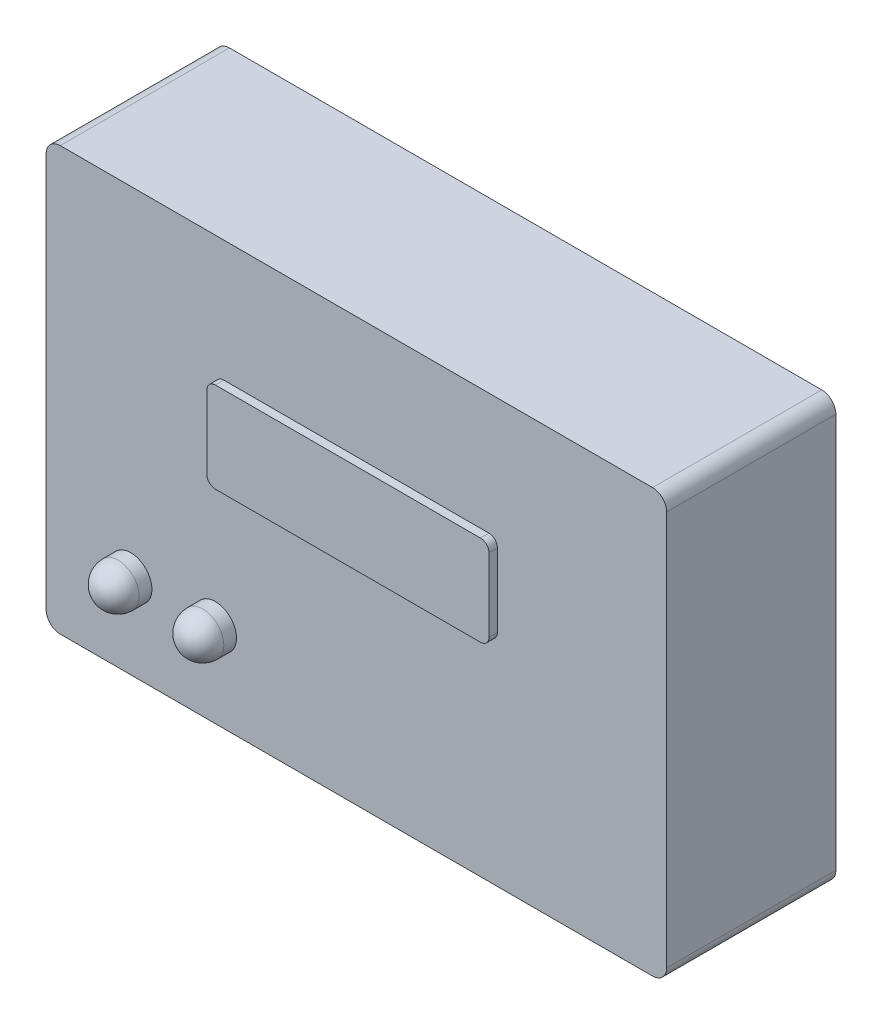
ISO-10303-21;
HEADER;
FILE_DESCRIPTION(('STEP AP214'),'2;1');
FILE_NAME('part.step','',(''),(''),'','','');
FILE_SCHEMA(('AUTOMOTIVE_DESIGN { 1 0 10303 214 1 1 1 1 }'));
ENDSEC;
DATA;
#1=APPLICATION_CONTEXT('core data for automotive mechanical design processes');
#2=APPLICATION_PROTOCOL_DEFINITION('international standard','automotive_design',2000,#1);
#3=PRODUCT_CONTEXT('',#1,'mechanical');
#4=PRODUCT('Part','Part','',(#3));
#5=PRODUCT_RELATED_PRODUCT_CATEGORY('part','',(#4));
#6=PRODUCT_DEFINITION_FORMATION('','',#4);
#7=PRODUCT_DEFINITION_CONTEXT('part definition',#1,'design');
#8=PRODUCT_DEFINITION('design','',#6,#7);
#9=PRODUCT_DEFINITION_SHAPE('','',#8);
#10=(LENGTH_UNIT() NAMED_UNIT(*) SI_UNIT(.MILLI.,.METRE.));
#11=(NAMED_UNIT(*) PLANE_ANGLE_UNIT() SI_UNIT($,.RADIAN.));
#12=(NAMED_UNIT(*) SI_UNIT($,.STERADIAN.) SOLID_ANGLE_UNIT());
#13=UNCERTAINTY_MEASURE_WITH_UNIT(LENGTH_MEASURE(1.E-05),#10,'distance_accuracy_value','');
#14=(GEOMETRIC_REPRESENTATION_CONTEXT(3) GLOBAL_UNCERTAINTY_ASSIGNED_CONTEXT((#13)) GLOBAL_UNIT_ASSIGNED_CONTEXT((#10,
#11,#12)) REPRESENTATION_CONTEXT('',''));
#15=CARTESIAN_POINT('',(0.,0.,0.));
#16=DIRECTION('',(0.,0.,1.));
#17=DIRECTION('',(1.,0.,0.));
#18=AXIS2_PLACEMENT_3D('',#15,#16,#17);
#19=CARTESIAN_POINT('',(-50.,-45.,42.));
#20=DIRECTION('',(0.,0.,-1.));
#21=DIRECTION('',(-1.,0.,0.));
#22=AXIS2_PLACEMENT_3D('',#19,#20,#21);
#23=CYLINDRICAL_SURFACE('',#22,7.5);
#24=CARTESIAN_POINT('',(-50.,-45.,34.5));
#25=DIRECTION('',(0.,0.,-1.));
#26=DIRECTION('',(-1.,0.,0.));
#27=AXIS2_PLACEMENT_3D('',#24,#25,#26);
#28=CIRCLE('',#27,7.5);
#29=CARTESIAN_POINT('',(-57.5,-45.,34.5));
#30=VERTEX_POINT('',#29);
#31=EDGE_CURVE('E11',#30,#30,#28,.T.);
#32=ORIENTED_EDGE('',*,*,#31,.T.);
#33=EDGE_LOOP('',(#32));
#34=FACE_BOUND('',#33,.T.);
#35=CARTESIAN_POINT('',(-50.,-45.,30.));
#36=DIRECTION('',(0.,0.,1.));
#37=DIRECTION('',(1.,0.,0.));
#38=AXIS2_PLACEMENT_3D('',#35,#36,#37);
#39=CIRCLE('',#38,7.5);
#40=CARTESIAN_POINT('',(-42.5,-45.,30.));
#41=VERTEX_POINT('',#40);
#42=EDGE_CURVE('E61',#41,#41,#39,.T.);
#43=ORIENTED_EDGE('',*,*,#42,.T.);
#44=EDGE_LOOP('',(#43));
#45=FACE_BOUND('',#44,.T.);
#46=ADVANCED_FACE('F54',(#34,#45),#23,.T.);
#47=CARTESIAN_POINT('',(-50.,-45.,30.));
#48=DIRECTION('',(0.,0.,1.));
#49=DIRECTION('',(1.,0.,0.));
#50=AXIS2_PLACEMENT_3D('',#47,#48,#49);
#51=PLANE('',#50);
#52=ORIENTED_EDGE('',*,*,#42,.F.);
#53=EDGE_LOOP('',(#52));
#54=FACE_BOUND('',#53,.T.);
#55=ADVANCED_FACE('F68',(#54),#51,.F.);
#56=CARTESIAN_POINT('',(-50.,-45.,34.5));
#57=DIRECTION('',(0.,0.,1.));
#58=DIRECTION('',(1.,0.,0.));
#59=AXIS2_PLACEMENT_3D('',#56,#57,#58);
#60=SPHERICAL_SURFACE('',#59,7.5);
#61=ORIENTED_EDGE('',*,*,#31,.F.);
#62=EDGE_LOOP('',(#61));
#63=FACE_BOUND('',#62,.T.);
#64=ADVANCED_FACE('F56',(#63),#60,.T.);
#65=CLOSED_SHELL('',(#46,#55,#64));
#66=MANIFOLD_SOLID_BREP('B2',#65);
#67=CARTESIAN_POINT('',(-80.,-45.,42.));
#68=DIRECTION('',(0.,0.,-1.));
#69=DIRECTION('',(-1.,0.,0.));
#70=AXIS2_PLACEMENT_3D('',#67,#68,#69);
#71=CYLINDRICAL_SURFACE('',#70,7.50000000000001);
#72=CARTESIAN_POINT('',(-80.,-45.,34.5));
#73=DIRECTION('',(0.,0.,-1.));
#74=DIRECTION('',(-1.,0.,0.));
#75=AXIS2_PLACEMENT_3D('',#72,#73,#74);
#76=CIRCLE('',#75,7.50000000000001);
#77=CARTESIAN_POINT('',(-87.5,-45.,34.5));
#78=VERTEX_POINT('',#77);
#79=EDGE_CURVE('E53',#78,#78,#76,.T.);
#80=ORIENTED_EDGE('',*,*,#79,.T.);
#81=EDGE_LOOP('',(#80));
#82=FACE_BOUND('',#81,.T.);
#83=CARTESIAN_POINT('',(-80.,-45.,30.));
#84=DIRECTION('',(0.,0.,1.));
#85=DIRECTION('',(1.,0.,0.));
#86=AXIS2_PLACEMENT_3D('',#83,#84,#85);
#87=CIRCLE('',#86,7.50000000000001);
#88=CARTESIAN_POINT('',(-72.5,-45.,30.));
#89=VERTEX_POINT('',#88);
#90=EDGE_CURVE('E112',#89,#89,#87,.T.);
#91=ORIENTED_EDGE('',*,*,#90,.T.);
#92=EDGE_LOOP('',(#91));
#93=FACE_BOUND('',#92,.T.);
#94=ADVANCED_FACE('F105',(#82,#93),#71,.T.);
#95=CARTESIAN_POINT('',(-80.,-45.,30.));
#96=DIRECTION('',(0.,0.,1.));
#97=DIRECTION('',(1.,0.,0.));
#98=AXIS2_PLACEMENT_3D('',#95,#96,#97);
#99=PLANE('',#98);
#100=ORIENTED_EDGE('',*,*,#90,.F.);
#101=EDGE_LOOP('',(#100));
#102=FACE_BOUND('',#101,.T.);
#103=ADVANCED_FACE('F119',(#102),#99,.F.);
#104=CARTESIAN_POINT('',(-80.,-45.,34.5));
#105=DIRECTION('',(0.,0.,1.));
#106=DIRECTION('',(1.,0.,0.));
#107=AXIS2_PLACEMENT_3D('',#104,#105,#106);
#108=SPHERICAL_SURFACE('',#107,7.5);
#109=ORIENTED_EDGE('',*,*,#79,.F.);
#110=EDGE_LOOP('',(#109));
#111=FACE_BOUND('',#110,.T.);
#112=ADVANCED_FACE('F107',(#111),#108,.T.);
#113=CLOSED_SHELL('',(#94,#103,#112));
#114=MANIFOLD_SOLID_BREP('B6',#113);
#115=CARTESIAN_POINT('',(47.,3.,33.));
#116=DIRECTION('',(0.,0.,-1.));
#117=DIRECTION('',(-1.,0.,0.));
#118=AXIS2_PLACEMENT_3D('',#115,#116,#117);
#119=CYLINDRICAL_SURFACE('',#118,3.);
#120=CARTESIAN_POINT('',(47.,3.,30.));
#121=DIRECTION('',(0.,0.,1.));
#122=DIRECTION('',(1.,0.,0.));
#123=AXIS2_PLACEMENT_3D('',#120,#121,#122);
#124=CIRCLE('',#123,3.);
#125=CARTESIAN_POINT('',(47.,0.,30.));
#126=VERTEX_POINT('',#125);
#127=CARTESIAN_POINT('',(50.,3.00000000000002,30.));
#128=VERTEX_POINT('',#127);
#129=EDGE_CURVE('E250',#126,#128,#124,.T.);
#130=ORIENTED_EDGE('',*,*,#129,.T.);
#131=DIRECTION('',(0.,0.,-1.));
#132=VECTOR('',#131,1.);
#133=CARTESIAN_POINT('',(50.,3.00000000000002,33.));
#134=LINE('',#133,#132);
#135=CARTESIAN_POINT('',(50.,3.00000000000002,33.));
#136=VERTEX_POINT('',#135);
#137=EDGE_CURVE('E103',#136,#128,#134,.T.);
#138=ORIENTED_EDGE('',*,*,#137,.F.);
#139=CARTESIAN_POINT('',(47.,3.,33.));
#140=DIRECTION('',(0.,0.,1.));
#141=DIRECTION('',(1.,0.,0.));
#142=AXIS2_PLACEMENT_3D('',#139,#140,#141);
#143=CIRCLE('',#142,3.);
#144=CARTESIAN_POINT('',(47.,0.,33.));
#145=VERTEX_POINT('',#144);
#146=EDGE_CURVE('E264',#145,#136,#143,.T.);
#147=ORIENTED_EDGE('',*,*,#146,.F.);
#148=DIRECTION('',(0.,0.,-1.));
#149=VECTOR('',#148,1.);
#150=CARTESIAN_POINT('',(47.,0.,33.));
#151=LINE('',#150,#149);
#152=EDGE_CURVE('E246',#145,#126,#151,.T.);
#153=ORIENTED_EDGE('',*,*,#152,.T.);
#154=EDGE_LOOP('',(#130,#138,#147,#153));
#155=FACE_BOUND('',#154,.T.);
#156=ADVANCED_FACE('F154',(#155),#119,.T.);
#157=CARTESIAN_POINT('',(50.,29.,33.));
#158=DIRECTION('',(-1.,0.,0.));
#159=DIRECTION('',(0.,0.,1.));
#160=AXIS2_PLACEMENT_3D('',#157,#158,#159);
#161=PLANE('',#160);
#162=DIRECTION('',(0.,1.,0.));
#163=VECTOR('',#162,1.);
#164=CARTESIAN_POINT('',(50.,29.,30.));
#165=LINE('',#164,#163);
#166=CARTESIAN_POINT('',(50.,29.,30.));
#167=VERTEX_POINT('',#166);
#168=EDGE_CURVE('E253',#128,#167,#165,.T.);
#169=ORIENTED_EDGE('',*,*,#168,.T.);
#170=DIRECTION('',(0.,0.,-1.));
#171=VECTOR('',#170,1.);
#172=CARTESIAN_POINT('',(50.,29.,33.));
#173=LINE('',#172,#171);
#174=CARTESIAN_POINT('',(50.,29.,33.));
#175=VERTEX_POINT('',#174);
#176=EDGE_CURVE('E162',#175,#167,#173,.T.);
#177=ORIENTED_EDGE('',*,*,#176,.F.);
#178=DIRECTION('',(0.,1.,0.));
#179=VECTOR('',#178,1.);
#180=CARTESIAN_POINT('',(50.,29.,33.));
#181=LINE('',#180,#179);
#182=EDGE_CURVE('E213',#136,#175,#181,.T.);
#183=ORIENTED_EDGE('',*,*,#182,.F.);
#184=ORIENTED_EDGE('',*,*,#137,.T.);
#185=EDGE_LOOP('',(#169,#177,#183,#184));
#186=FACE_BOUND('',#185,.T.);
#187=ADVANCED_FACE('F299',(#186),#161,.F.);
#188=CARTESIAN_POINT('',(47.,29.,33.));
#189=DIRECTION('',(0.,0.,-1.));
#190=DIRECTION('',(-1.,0.,0.));
#191=AXIS2_PLACEMENT_3D('',#188,#189,#190);
#192=CYLINDRICAL_SURFACE('',#191,3.);
#193=CARTESIAN_POINT('',(47.,29.,30.));
#194=DIRECTION('',(0.,0.,1.));
#195=DIRECTION('',(-1.,0.,0.));
#196=AXIS2_PLACEMENT_3D('',#193,#194,#195);
#197=CIRCLE('',#196,3.);
#198=CARTESIAN_POINT('',(47.,32.,30.));
#199=VERTEX_POINT('',#198);
#200=EDGE_CURVE('E255',#167,#199,#197,.T.);
#201=ORIENTED_EDGE('',*,*,#200,.T.);
#202=DIRECTION('',(0.,0.,-1.));
#203=VECTOR('',#202,1.);
#204=CARTESIAN_POINT('',(47.,32.,33.));
#205=LINE('',#204,#203);
#206=CARTESIAN_POINT('',(47.,32.,33.));
#207=VERTEX_POINT('',#206);
#208=EDGE_CURVE('E271',#207,#199,#205,.T.);
#209=ORIENTED_EDGE('',*,*,#208,.F.);
#210=CARTESIAN_POINT('',(47.,29.,33.));
#211=DIRECTION('',(0.,0.,1.));
#212=DIRECTION('',(-1.,0.,0.));
#213=AXIS2_PLACEMENT_3D('',#210,#211,#212);
#214=CIRCLE('',#213,3.);
#215=EDGE_CURVE('E279',#175,#207,#214,.T.);
#216=ORIENTED_EDGE('',*,*,#215,.F.);
#217=ORIENTED_EDGE('',*,*,#176,.T.);
#218=EDGE_LOOP('',(#201,#209,#216,#217));
#219=FACE_BOUND('',#218,.T.);
#220=ADVANCED_FACE('F277',(#219),#192,.T.);
#221=CARTESIAN_POINT('',(-47.,32.,33.));
#222=DIRECTION('',(0.,-1.,0.));
#223=DIRECTION('',(0.,0.,-1.));
#224=AXIS2_PLACEMENT_3D('',#221,#222,#223);
#225=PLANE('',#224);
#226=DIRECTION('',(-1.,0.,0.));
#227=VECTOR('',#226,1.);
#228=CARTESIAN_POINT('',(-47.,32.,30.));
#229=LINE('',#228,#227);
#230=CARTESIAN_POINT('',(-47.,32.,30.));
#231=VERTEX_POINT('',#230);
#232=EDGE_CURVE('E257',#199,#231,#229,.T.);
#233=ORIENTED_EDGE('',*,*,#232,.T.);
#234=DIRECTION('',(0.,0.,-1.));
#235=VECTOR('',#234,1.);
#236=CARTESIAN_POINT('',(-47.,32.,33.));
#237=LINE('',#236,#235);
#238=CARTESIAN_POINT('',(-47.,32.,33.));
#239=VERTEX_POINT('',#238);
#240=EDGE_CURVE('E268',#239,#231,#237,.T.);
#241=ORIENTED_EDGE('',*,*,#240,.F.);
#242=DIRECTION('',(-1.,0.,0.));
#243=VECTOR('',#242,1.);
#244=CARTESIAN_POINT('',(-47.,32.,33.));
#245=LINE('',#244,#243);
#246=EDGE_CURVE('E291',#207,#239,#245,.T.);
#247=ORIENTED_EDGE('',*,*,#246,.F.);
#248=ORIENTED_EDGE('',*,*,#208,.T.);
#249=EDGE_LOOP('',(#233,#241,#247,#248));
#250=FACE_BOUND('',#249,.T.);
#251=ADVANCED_FACE('F287',(#250),#225,.F.);
#252=CARTESIAN_POINT('',(-47.,29.,33.));
#253=DIRECTION('',(0.,0.,-1.));
#254=DIRECTION('',(-1.,0.,0.));
#255=AXIS2_PLACEMENT_3D('',#252,#253,#254);
#256=CYLINDRICAL_SURFACE('',#255,3.);
#257=CARTESIAN_POINT('',(-47.,29.,30.));
#258=DIRECTION('',(0.,0.,1.));
#259=DIRECTION('',(1.,0.,0.));
#260=AXIS2_PLACEMENT_3D('',#257,#258,#259);
#261=CIRCLE('',#260,3.);
#262=CARTESIAN_POINT('',(-50.,29.,30.));
#263=VERTEX_POINT('',#262);
#264=EDGE_CURVE('E259',#231,#263,#261,.T.);
#265=ORIENTED_EDGE('',*,*,#264,.T.);
#266=DIRECTION('',(0.,0.,-1.));
#267=VECTOR('',#266,1.);
#268=CARTESIAN_POINT('',(-50.,29.,33.));
#269=LINE('',#268,#267);
#270=CARTESIAN_POINT('',(-50.,29.,33.));
#271=VERTEX_POINT('',#270);
#272=EDGE_CURVE('E241',#271,#263,#269,.T.);
#273=ORIENTED_EDGE('',*,*,#272,.F.);
#274=CARTESIAN_POINT('',(-47.,29.,33.));
#275=DIRECTION('',(0.,0.,1.));
#276=DIRECTION('',(1.,0.,0.));
#277=AXIS2_PLACEMENT_3D('',#274,#275,#276);
#278=CIRCLE('',#277,3.);
#279=EDGE_CURVE('E232',#239,#271,#278,.T.);
#280=ORIENTED_EDGE('',*,*,#279,.F.);
#281=ORIENTED_EDGE('',*,*,#240,.T.);
#282=EDGE_LOOP('',(#265,#273,#280,#281));
#283=FACE_BOUND('',#282,.T.);
#284=ADVANCED_FACE('F290',(#283),#256,.T.);
#285=CARTESIAN_POINT('',(-50.,29.,33.));
#286=DIRECTION('',(1.,0.,0.));
#287=DIRECTION('',(0.,0.,-1.));
#288=AXIS2_PLACEMENT_3D('',#285,#286,#287);
#289=PLANE('',#288);
#290=DIRECTION('',(0.,-1.,0.));
#291=VECTOR('',#290,1.);
#292=CARTESIAN_POINT('',(-50.,29.,30.));
#293=LINE('',#292,#291);
#294=CARTESIAN_POINT('',(-50.,3.00000000000002,30.));
#295=VERTEX_POINT('',#294);
#296=EDGE_CURVE('E240',#263,#295,#293,.T.);
#297=ORIENTED_EDGE('',*,*,#296,.T.);
#298=DIRECTION('',(0.,0.,-1.));
#299=VECTOR('',#298,1.);
#300=CARTESIAN_POINT('',(-50.,3.00000000000002,33.));
#301=LINE('',#300,#299);
#302=CARTESIAN_POINT('',(-50.,3.00000000000002,33.));
#303=VERTEX_POINT('',#302);
#304=EDGE_CURVE('E237',#303,#295,#301,.T.);
#305=ORIENTED_EDGE('',*,*,#304,.F.);
#306=DIRECTION('',(0.,-1.,0.));
#307=VECTOR('',#306,1.);
#308=CARTESIAN_POINT('',(-50.,29.,33.));
#309=LINE('',#308,#307);
#310=EDGE_CURVE('E226',#271,#303,#309,.T.);
#311=ORIENTED_EDGE('',*,*,#310,.F.);
#312=ORIENTED_EDGE('',*,*,#272,.T.);
#313=EDGE_LOOP('',(#297,#305,#311,#312));
#314=FACE_BOUND('',#313,.T.);
#315=ADVANCED_FACE('F238',(#314),#289,.F.);
#316=CARTESIAN_POINT('',(-47.,3.,33.));
#317=DIRECTION('',(0.,0.,-1.));
#318=DIRECTION('',(-1.,0.,0.));
#319=AXIS2_PLACEMENT_3D('',#316,#317,#318);
#320=CYLINDRICAL_SURFACE('',#319,3.);
#321=CARTESIAN_POINT('',(-47.,3.,30.));
#322=DIRECTION('',(0.,0.,1.));
#323=DIRECTION('',(1.,0.,0.));
#324=AXIS2_PLACEMENT_3D('',#321,#322,#323);
#325=CIRCLE('',#324,3.);
#326=CARTESIAN_POINT('',(-47.,0.,30.));
#327=VERTEX_POINT('',#326);
#328=EDGE_CURVE('E199',#295,#327,#325,.T.);
#329=ORIENTED_EDGE('',*,*,#328,.T.);
#330=DIRECTION('',(0.,0.,-1.));
#331=VECTOR('',#330,1.);
#332=CARTESIAN_POINT('',(-47.,0.,33.));
#333=LINE('',#332,#331);
#334=CARTESIAN_POINT('',(-47.,0.,33.));
#335=VERTEX_POINT('',#334);
#336=EDGE_CURVE('E242',#335,#327,#333,.T.);
#337=ORIENTED_EDGE('',*,*,#336,.F.);
#338=CARTESIAN_POINT('',(-47.,3.,33.));
#339=DIRECTION('',(0.,0.,1.));
#340=DIRECTION('',(1.,0.,0.));
#341=AXIS2_PLACEMENT_3D('',#338,#339,#340);
#342=CIRCLE('',#341,3.);
#343=EDGE_CURVE('E230',#303,#335,#342,.T.);
#344=ORIENTED_EDGE('',*,*,#343,.F.);
#345=ORIENTED_EDGE('',*,*,#304,.T.);
#346=EDGE_LOOP('',(#329,#337,#344,#345));
#347=FACE_BOUND('',#346,.T.);
#348=ADVANCED_FACE('F244',(#347),#320,.T.);
#349=CARTESIAN_POINT('',(-47.,0.,33.));
#350=DIRECTION('',(0.,1.,0.));
#351=DIRECTION('',(0.,0.,1.));
#352=AXIS2_PLACEMENT_3D('',#349,#350,#351);
#353=PLANE('',#352);
#354=DIRECTION('',(1.,0.,0.));
#355=VECTOR('',#354,1.);
#356=CARTESIAN_POINT('',(-47.,0.,30.));
#357=LINE('',#356,#355);
#358=EDGE_CURVE('E205',#327,#126,#357,.T.);
#359=ORIENTED_EDGE('',*,*,#358,.T.);
#360=ORIENTED_EDGE('',*,*,#152,.F.);
#361=DIRECTION('',(1.,0.,0.));
#362=VECTOR('',#361,1.);
#363=CARTESIAN_POINT('',(-47.,0.,33.));
#364=LINE('',#363,#362);
#365=EDGE_CURVE('E170',#335,#145,#364,.T.);
#366=ORIENTED_EDGE('',*,*,#365,.F.);
#367=ORIENTED_EDGE('',*,*,#336,.T.);
#368=EDGE_LOOP('',(#359,#360,#366,#367));
#369=FACE_BOUND('',#368,.T.);
#370=ADVANCED_FACE('F315',(#369),#353,.F.);
#371=CARTESIAN_POINT('',(47.,3.,33.));
#372=DIRECTION('',(0.,0.,1.));
#373=DIRECTION('',(1.,0.,0.));
#374=AXIS2_PLACEMENT_3D('',#371,#372,#373);
#375=PLANE('',#374);
#376=ORIENTED_EDGE('',*,*,#146,.T.);
#377=ORIENTED_EDGE('',*,*,#182,.T.);
#378=ORIENTED_EDGE('',*,*,#215,.T.);
#379=ORIENTED_EDGE('',*,*,#246,.T.);
#380=ORIENTED_EDGE('',*,*,#279,.T.);
#381=ORIENTED_EDGE('',*,*,#310,.T.);
#382=ORIENTED_EDGE('',*,*,#343,.T.);
#383=ORIENTED_EDGE('',*,*,#365,.T.);
#384=EDGE_LOOP('',(#376,#377,#378,#379,#380,#381,#382,#383));
#385=FACE_BOUND('',#384,.T.);
#386=ADVANCED_FACE('F228',(#385),#375,.T.);
#387=CARTESIAN_POINT('',(47.,3.,30.));
#388=DIRECTION('',(0.,0.,1.));
#389=DIRECTION('',(1.,0.,0.));
#390=AXIS2_PLACEMENT_3D('',#387,#388,#389);
#391=PLANE('',#390);
#392=ORIENTED_EDGE('',*,*,#129,.F.);
#393=ORIENTED_EDGE('',*,*,#358,.F.);
#394=ORIENTED_EDGE('',*,*,#328,.F.);
#395=ORIENTED_EDGE('',*,*,#296,.F.);
#396=ORIENTED_EDGE('',*,*,#264,.F.);
#397=ORIENTED_EDGE('',*,*,#232,.F.);
#398=ORIENTED_EDGE('',*,*,#200,.F.);
#399=ORIENTED_EDGE('',*,*,#168,.F.);
#400=EDGE_LOOP('',(#392,#393,#394,#395,#396,#397,#398,#399));
#401=FACE_BOUND('',#400,.T.);
#402=ADVANCED_FACE('F283',(#401),#391,.F.);
#403=CLOSED_SHELL('',(#156,#187,#220,#251,#284,#315,#348,#370,#386,#402));
#404=MANIFOLD_SOLID_BREP('B48',#403);
#405=CARTESIAN_POINT('',(25.,0.,-16.));
#406=DIRECTION('',(0.,0.,1.));
#407=DIRECTION('',(1.,0.,0.));
#408=AXIS2_PLACEMENT_3D('',#405,#406,#407);
#409=CYLINDRICAL_SURFACE('',#408,5.);
#410=CARTESIAN_POINT('',(25.,0.,-16.));
#411=DIRECTION('',(0.,0.,-1.));
#412=DIRECTION('',(-1.,0.,0.));
#413=AXIS2_PLACEMENT_3D('',#410,#411,#412);
#414=CIRCLE('',#413,5.);
#415=CARTESIAN_POINT('',(20.,0.,-16.));
#416=VERTEX_POINT('',#415);
#417=EDGE_CURVE('E397',#416,#416,#414,.T.);
#418=ORIENTED_EDGE('',*,*,#417,.T.);
#419=EDGE_LOOP('',(#418));
#420=FACE_BOUND('',#419,.T.);
#421=CARTESIAN_POINT('',(25.,0.,-10.));
#422=DIRECTION('',(0.,0.,-1.));
#423=DIRECTION('',(-1.,0.,0.));
#424=AXIS2_PLACEMENT_3D('',#421,#422,#423);
#425=CIRCLE('',#424,5.);
#426=CARTESIAN_POINT('',(20.,0.,-10.));
#427=VERTEX_POINT('',#426);
#428=EDGE_CURVE('E403',#427,#427,#425,.T.);
#429=ORIENTED_EDGE('',*,*,#428,.F.);
#430=EDGE_LOOP('',(#429));
#431=FACE_BOUND('',#430,.T.);
#432=ADVANCED_FACE('F390',(#420,#431),#409,.F.);
#433=CARTESIAN_POINT('',(25.,0.,-16.));
#434=DIRECTION('',(0.,0.,1.));
#435=DIRECTION('',(1.,0.,0.));
#436=AXIS2_PLACEMENT_3D('',#433,#434,#435);
#437=CYLINDRICAL_SURFACE('',#436,7.);
#438=CARTESIAN_POINT('',(25.,0.,-16.));
#439=DIRECTION('',(0.,0.,-1.));
#440=DIRECTION('',(-1.,0.,0.));
#441=AXIS2_PLACEMENT_3D('',#438,#439,#440);
#442=CIRCLE('',#441,7.);
#443=CARTESIAN_POINT('',(18.,0.,-16.));
#444=VERTEX_POINT('',#443);
#445=EDGE_CURVE('E153',#444,#444,#442,.T.);
#446=ORIENTED_EDGE('',*,*,#445,.F.);
#447=EDGE_LOOP('',(#446));
#448=FACE_BOUND('',#447,.T.);
#449=CARTESIAN_POINT('',(25.,0.,-10.));
#450=DIRECTION('',(0.,0.,-1.));
#451=DIRECTION('',(-1.,0.,0.));
#452=AXIS2_PLACEMENT_3D('',#449,#450,#451);
#453=CIRCLE('',#452,7.);
#454=CARTESIAN_POINT('',(18.,0.,-10.));
#455=VERTEX_POINT('',#454);
#456=EDGE_CURVE('E393',#455,#455,#453,.T.);
#457=ORIENTED_EDGE('',*,*,#456,.T.);
#458=EDGE_LOOP('',(#457));
#459=FACE_BOUND('',#458,.T.);
#460=ADVANCED_FACE('F410',(#448,#459),#437,.T.);
#461=CARTESIAN_POINT('',(0.,0.,-16.));
#462=DIRECTION('',(0.,0.,-1.));
#463=DIRECTION('',(-1.,0.,0.));
#464=AXIS2_PLACEMENT_3D('',#461,#462,#463);
#465=PLANE('',#464);
#466=ORIENTED_EDGE('',*,*,#417,.F.);
#467=EDGE_LOOP('',(#466));
#468=FACE_BOUND('',#467,.T.);
#469=ORIENTED_EDGE('',*,*,#445,.T.);
#470=EDGE_LOOP('',(#469));
#471=FACE_BOUND('',#470,.T.);
#472=ADVANCED_FACE('F414',(#468,#471),#465,.T.);
#473=CARTESIAN_POINT('',(0.,0.,-10.));
#474=DIRECTION('',(0.,0.,-1.));
#475=DIRECTION('',(-1.,0.,0.));
#476=AXIS2_PLACEMENT_3D('',#473,#474,#475);
#477=PLANE('',#476);
#478=ORIENTED_EDGE('',*,*,#428,.T.);
#479=EDGE_LOOP('',(#478));
#480=FACE_BOUND('',#479,.T.);
#481=ORIENTED_EDGE('',*,*,#456,.F.);
#482=EDGE_LOOP('',(#481));
#483=FACE_BOUND('',#482,.T.);
#484=ADVANCED_FACE('F412',(#480,#483),#477,.F.);
#485=CLOSED_SHELL('',(#432,#460,#472,#484));
#486=MANIFOLD_SOLID_BREP('B97',#485);
#487=CARTESIAN_POINT('',(25.,0.,-15.));
#488=DIRECTION('',(0.,0.,1.));
#489=DIRECTION('',(1.,0.,0.));
#490=AXIS2_PLACEMENT_3D('',#487,#488,#489);
#491=CYLINDRICAL_SURFACE('',#490,5.);
#492=CARTESIAN_POINT('',(25.,0.,-15.));
#493=DIRECTION('',(0.,0.,-1.));
#494=DIRECTION('',(-1.,0.,0.));
#495=AXIS2_PLACEMENT_3D('',#492,#493,#494);
#496=CIRCLE('',#495,5.);
#497=CARTESIAN_POINT('',(20.,0.,-15.));
#498=VERTEX_POINT('',#497);
#499=EDGE_CURVE('E389',#498,#498,#496,.T.);
#500=ORIENTED_EDGE('',*,*,#499,.F.);
#501=EDGE_LOOP('',(#500));
#502=FACE_BOUND('',#501,.T.);
#503=CARTESIAN_POINT('',(25.,0.,-10.));
#504=DIRECTION('',(0.,0.,-1.));
#505=DIRECTION('',(-1.,0.,0.));
#506=AXIS2_PLACEMENT_3D('',#503,#504,#505);
#507=CIRCLE('',#506,5.);
#508=CARTESIAN_POINT('',(20.,0.,-10.));
#509=VERTEX_POINT('',#508);
#510=EDGE_CURVE('E463',#509,#509,#507,.T.);
#511=ORIENTED_EDGE('',*,*,#510,.T.);
#512=EDGE_LOOP('',(#511));
#513=FACE_BOUND('',#512,.T.);
#514=ADVANCED_FACE('F460',(#502,#513),#491,.T.);
#515=CARTESIAN_POINT('',(0.,0.,-15.));
#516=DIRECTION('',(0.,0.,-1.));
#517=DIRECTION('',(-1.,0.,0.));
#518=AXIS2_PLACEMENT_3D('',#515,#516,#517);
#519=PLANE('',#518);
#520=ORIENTED_EDGE('',*,*,#499,.T.);
#521=EDGE_LOOP('',(#520));
#522=FACE_BOUND('',#521,.T.);
#523=ADVANCED_FACE('F475',(#522),#519,.T.);
#524=CARTESIAN_POINT('',(0.,0.,-10.));
#525=DIRECTION('',(0.,0.,-1.));
#526=DIRECTION('',(-1.,0.,0.));
#527=AXIS2_PLACEMENT_3D('',#524,#525,#526);
#528=PLANE('',#527);
#529=ORIENTED_EDGE('',*,*,#510,.F.);
#530=EDGE_LOOP('',(#529));
#531=FACE_BOUND('',#530,.T.);
#532=ADVANCED_FACE('F473',(#531),#528,.F.);
#533=CLOSED_SHELL('',(#514,#523,#532));
#534=MANIFOLD_SOLID_BREP('B148',#533);
#535=CARTESIAN_POINT('',(-25.,0.,-13.));
#536=DIRECTION('',(0.,0.,1.));
#537=DIRECTION('',(1.,0.,0.));
#538=AXIS2_PLACEMENT_3D('',#535,#536,#537);
#539=CYLINDRICAL_SURFACE('',#538,2.5);
#540=CARTESIAN_POINT('',(-25.,0.,-13.));
#541=DIRECTION('',(0.,0.,-1.));
#542=DIRECTION('',(-1.,0.,0.));
#543=AXIS2_PLACEMENT_3D('',#540,#541,#542);
#544=CIRCLE('',#543,2.5);
#545=CARTESIAN_POINT('',(-27.5,0.,-13.));
#546=VERTEX_POINT('',#545);
#547=EDGE_CURVE('E459',#546,#546,#544,.T.);
#548=ORIENTED_EDGE('',*,*,#547,.F.);
#549=EDGE_LOOP('',(#548));
#550=FACE_BOUND('',#549,.T.);
#551=CARTESIAN_POINT('',(-25.,0.,-10.));
#552=DIRECTION('',(0.,0.,-1.));
#553=DIRECTION('',(-1.,0.,0.));
#554=AXIS2_PLACEMENT_3D('',#551,#552,#553);
#555=CIRCLE('',#554,2.5);
#556=CARTESIAN_POINT('',(-27.5,0.,-10.));
#557=VERTEX_POINT('',#556);
#558=EDGE_CURVE('E513',#557,#557,#555,.T.);
#559=ORIENTED_EDGE('',*,*,#558,.T.);
#560=EDGE_LOOP('',(#559));
#561=FACE_BOUND('',#560,.T.);
#562=ADVANCED_FACE('F510',(#550,#561),#539,.T.);
#563=CARTESIAN_POINT('',(-25.,0.,-13.));
#564=DIRECTION('',(0.,0.,-1.));
#565=DIRECTION('',(-1.,0.,0.));
#566=AXIS2_PLACEMENT_3D('',#563,#564,#565);
#567=PLANE('',#566);
#568=ORIENTED_EDGE('',*,*,#547,.T.);
#569=EDGE_LOOP('',(#568));
#570=FACE_BOUND('',#569,.T.);
#571=ADVANCED_FACE('F525',(#570),#567,.T.);
#572=CARTESIAN_POINT('',(-25.,0.,-10.));
#573=DIRECTION('',(0.,0.,-1.));
#574=DIRECTION('',(-1.,0.,0.));
#575=AXIS2_PLACEMENT_3D('',#572,#573,#574);
#576=PLANE('',#575);
#577=ORIENTED_EDGE('',*,*,#558,.F.);
#578=EDGE_LOOP('',(#577));
#579=FACE_BOUND('',#578,.T.);
#580=ADVANCED_FACE('F523',(#579),#576,.F.);
#581=CLOSED_SHELL('',(#562,#571,#580));
#582=MANIFOLD_SOLID_BREP('B384',#581);
#583=CARTESIAN_POINT('',(105.,-70.,30.));
#584=DIRECTION('',(0.,0.,-1.));
#585=DIRECTION('',(-1.,0.,0.));
#586=AXIS2_PLACEMENT_3D('',#583,#584,#585);
#587=CYLINDRICAL_SURFACE('',#586,5.);
#588=CARTESIAN_POINT('',(105.,-70.,-30.));
#589=DIRECTION('',(0.,0.,1.));
#590=DIRECTION('',(1.,0.,0.));
#591=AXIS2_PLACEMENT_3D('',#588,#589,#590);
#592=CIRCLE('',#591,5.);
#593=CARTESIAN_POINT('',(105.,-75.,-30.));
#594=VERTEX_POINT('',#593);
#595=CARTESIAN_POINT('',(110.,-70.,-30.));
#596=VERTEX_POINT('',#595);
#597=EDGE_CURVE('E664',#594,#596,#592,.T.);
#598=ORIENTED_EDGE('',*,*,#597,.T.);
#599=DIRECTION('',(0.,0.,-1.));
#600=VECTOR('',#599,1.);
#601=CARTESIAN_POINT('',(110.,-70.,30.));
#602=LINE('',#601,#600);
#603=CARTESIAN_POINT('',(110.,-70.,30.));
#604=VERTEX_POINT('',#603);
#605=EDGE_CURVE('E508',#604,#596,#602,.T.);
#606=ORIENTED_EDGE('',*,*,#605,.F.);
#607=CARTESIAN_POINT('',(105.,-70.,30.));
#608=DIRECTION('',(0.,0.,1.));
#609=DIRECTION('',(1.,0.,0.));
#610=AXIS2_PLACEMENT_3D('',#607,#608,#609);
#611=CIRCLE('',#610,5.);
#612=CARTESIAN_POINT('',(105.,-75.,30.));
#613=VERTEX_POINT('',#612);
#614=EDGE_CURVE('E688',#613,#604,#611,.T.);
#615=ORIENTED_EDGE('',*,*,#614,.F.);
#616=DIRECTION('',(0.,0.,-1.));
#617=VECTOR('',#616,1.);
#618=CARTESIAN_POINT('',(105.,-75.,30.));
#619=LINE('',#618,#617);
#620=EDGE_CURVE('E660',#613,#594,#619,.T.);
#621=ORIENTED_EDGE('',*,*,#620,.T.);
#622=EDGE_LOOP('',(#598,#606,#615,#621));
#623=FACE_BOUND('',#622,.T.);
#624=ADVANCED_FACE('F551',(#623),#587,.T.);
#625=CARTESIAN_POINT('',(110.,-70.,30.));
#626=DIRECTION('',(-1.,0.,0.));
#627=DIRECTION('',(0.,-1.,0.));
#628=AXIS2_PLACEMENT_3D('',#625,#626,#627);
#629=PLANE('',#628);
#630=DIRECTION('',(0.,1.,0.));
#631=VECTOR('',#630,1.);
#632=CARTESIAN_POINT('',(110.,-70.,-30.));
#633=LINE('',#632,#631);
#634=CARTESIAN_POINT('',(110.,70.,-30.));
#635=VERTEX_POINT('',#634);
#636=EDGE_CURVE('E668',#596,#635,#633,.T.);
#637=ORIENTED_EDGE('',*,*,#636,.T.);
#638=DIRECTION('',(0.,0.,-1.));
#639=VECTOR('',#638,1.);
#640=CARTESIAN_POINT('',(110.,70.,30.));
#641=LINE('',#640,#639);
#642=CARTESIAN_POINT('',(110.,70.,30.));
#643=VERTEX_POINT('',#642);
#644=EDGE_CURVE('E559',#643,#635,#641,.T.);
#645=ORIENTED_EDGE('',*,*,#644,.F.);
#646=DIRECTION('',(0.,1.,0.));
#647=VECTOR('',#646,1.);
#648=CARTESIAN_POINT('',(110.,-70.,30.));
#649=LINE('',#648,#647);
#650=EDGE_CURVE('E616',#604,#643,#649,.T.);
#651=ORIENTED_EDGE('',*,*,#650,.F.);
#652=ORIENTED_EDGE('',*,*,#605,.T.);
#653=EDGE_LOOP('',(#637,#645,#651,#652));
#654=FACE_BOUND('',#653,.T.);
#655=ADVANCED_FACE('F897',(#654),#629,.F.);
#656=CARTESIAN_POINT('',(105.,70.,30.));
#657=DIRECTION('',(0.,0.,-1.));
#658=DIRECTION('',(-1.,0.,0.));
#659=AXIS2_PLACEMENT_3D('',#656,#657,#658);
#660=CYLINDRICAL_SURFACE('',#659,5.);
#661=CARTESIAN_POINT('',(105.,70.,-30.));
#662=DIRECTION('',(0.,0.,1.));
#663=DIRECTION('',(-1.,0.,0.));
#664=AXIS2_PLACEMENT_3D('',#661,#662,#663);
#665=CIRCLE('',#664,5.);
#666=CARTESIAN_POINT('',(105.,75.,-30.));
#667=VERTEX_POINT('',#666);
#668=EDGE_CURVE('E672',#635,#667,#665,.T.);
#669=ORIENTED_EDGE('',*,*,#668,.T.);
#670=DIRECTION('',(0.,0.,-1.));
#671=VECTOR('',#670,1.);
#672=CARTESIAN_POINT('',(105.,75.,30.));
#673=LINE('',#672,#671);
#674=CARTESIAN_POINT('',(105.,75.,30.));
#675=VERTEX_POINT('',#674);
#676=EDGE_CURVE('E699',#675,#667,#673,.T.);
#677=ORIENTED_EDGE('',*,*,#676,.F.);
#678=CARTESIAN_POINT('',(105.,70.,30.));
#679=DIRECTION('',(0.,0.,1.));
#680=DIRECTION('',(-1.,0.,0.));
#681=AXIS2_PLACEMENT_3D('',#678,#679,#680);
#682=CIRCLE('',#681,5.);
#683=EDGE_CURVE('E709',#643,#675,#682,.T.);
#684=ORIENTED_EDGE('',*,*,#683,.F.);
#685=ORIENTED_EDGE('',*,*,#644,.T.);
#686=EDGE_LOOP('',(#669,#677,#684,#685));
#687=FACE_BOUND('',#686,.T.);
#688=ADVANCED_FACE('F707',(#687),#660,.T.);
#689=CARTESIAN_POINT('',(-105.,75.,30.));
#690=DIRECTION('',(0.,-1.,0.));
#691=DIRECTION('',(0.,0.,-1.));
#692=AXIS2_PLACEMENT_3D('',#689,#690,#691);
#693=PLANE('',#692);
#694=DIRECTION('',(-1.,0.,0.));
#695=VECTOR('',#694,1.);
#696=CARTESIAN_POINT('',(-105.,75.,-30.));
#697=LINE('',#696,#695);
#698=CARTESIAN_POINT('',(-105.,75.,-30.));
#699=VERTEX_POINT('',#698);
#700=EDGE_CURVE('E675',#667,#699,#697,.T.);
#701=ORIENTED_EDGE('',*,*,#700,.T.);
#702=DIRECTION('',(0.,0.,-1.));
#703=VECTOR('',#702,1.);
#704=CARTESIAN_POINT('',(-105.,75.,30.));
#705=LINE('',#704,#703);
#706=CARTESIAN_POINT('',(-105.,75.,30.));
#707=VERTEX_POINT('',#706);
#708=EDGE_CURVE('E695',#707,#699,#705,.T.);
#709=ORIENTED_EDGE('',*,*,#708,.F.);
#710=DIRECTION('',(-1.,0.,0.));
#711=VECTOR('',#710,1.);
#712=CARTESIAN_POINT('',(-105.,75.,30.));
#713=LINE('',#712,#711);
#714=EDGE_CURVE('E722',#675,#707,#713,.T.);
#715=ORIENTED_EDGE('',*,*,#714,.F.);
#716=ORIENTED_EDGE('',*,*,#676,.T.);
#717=EDGE_LOOP('',(#701,#709,#715,#716));
#718=FACE_BOUND('',#717,.T.);
#719=ADVANCED_FACE('F717',(#718),#693,.F.);
#720=CARTESIAN_POINT('',(-105.,70.,30.));
#721=DIRECTION('',(0.,0.,-1.));
#722=DIRECTION('',(-1.,0.,0.));
#723=AXIS2_PLACEMENT_3D('',#720,#721,#722);
#724=CYLINDRICAL_SURFACE('',#723,5.);
#725=CARTESIAN_POINT('',(-105.,70.,-30.));
#726=DIRECTION('',(0.,0.,1.));
#727=DIRECTION('',(-1.,0.,0.));
#728=AXIS2_PLACEMENT_3D('',#725,#726,#727);
#729=CIRCLE('',#728,5.);
#730=CARTESIAN_POINT('',(-110.,70.,-30.));
#731=VERTEX_POINT('',#730);
#732=EDGE_CURVE('E678',#699,#731,#729,.T.);
#733=ORIENTED_EDGE('',*,*,#732,.T.);
#734=DIRECTION('',(0.,0.,-1.));
#735=VECTOR('',#734,1.);
#736=CARTESIAN_POINT('',(-110.,70.,30.));
#737=LINE('',#736,#735);
#738=CARTESIAN_POINT('',(-110.,70.,30.));
#739=VERTEX_POINT('',#738);
#740=EDGE_CURVE('E653',#739,#731,#737,.T.);
#741=ORIENTED_EDGE('',*,*,#740,.F.);
#742=CARTESIAN_POINT('',(-105.,70.,30.));
#743=DIRECTION('',(0.,0.,1.));
#744=DIRECTION('',(-1.,0.,0.));
#745=AXIS2_PLACEMENT_3D('',#742,#743,#744);
#746=CIRCLE('',#745,5.);
#747=EDGE_CURVE('E639',#707,#739,#746,.T.);
#748=ORIENTED_EDGE('',*,*,#747,.F.);
#749=ORIENTED_EDGE('',*,*,#708,.T.);
#750=EDGE_LOOP('',(#733,#741,#748,#749));
#751=FACE_BOUND('',#750,.T.);
#752=ADVANCED_FACE('F720',(#751),#724,.T.);
#753=CARTESIAN_POINT('',(-110.,-70.,30.));
#754=DIRECTION('',(1.,0.,0.));
#755=DIRECTION('',(0.,0.,-1.));
#756=AXIS2_PLACEMENT_3D('',#753,#754,#755);
#757=PLANE('',#756);
#758=DIRECTION('',(0.,-1.,0.));
#759=VECTOR('',#758,1.);
#760=CARTESIAN_POINT('',(-110.,-70.,-30.));
#761=LINE('',#760,#759);
#762=CARTESIAN_POINT('',(-110.,-70.,-30.));
#763=VERTEX_POINT('',#762);
#764=EDGE_CURVE('E649',#731,#763,#761,.T.);
#765=ORIENTED_EDGE('',*,*,#764,.T.);
#766=DIRECTION('',(0.,0.,-1.));
#767=VECTOR('',#766,1.);
#768=CARTESIAN_POINT('',(-110.,-70.,30.));
#769=LINE('',#768,#767);
#770=CARTESIAN_POINT('',(-110.,-70.,30.));
#771=VERTEX_POINT('',#770);
#772=EDGE_CURVE('E646',#771,#763,#769,.T.);
#773=ORIENTED_EDGE('',*,*,#772,.F.);
#774=DIRECTION('',(0.,-1.,0.));
#775=VECTOR('',#774,1.);
#776=CARTESIAN_POINT('',(-110.,-70.,30.));
#777=LINE('',#776,#775);
#778=EDGE_CURVE('E632',#739,#771,#777,.T.);
#779=ORIENTED_EDGE('',*,*,#778,.F.);
#780=ORIENTED_EDGE('',*,*,#740,.T.);
#781=EDGE_LOOP('',(#765,#773,#779,#780));
#782=FACE_BOUND('',#781,.T.);
#783=ADVANCED_FACE('F647',(#782),#757,.F.);
#784=CARTESIAN_POINT('',(-105.,-70.,30.));
#785=DIRECTION('',(0.,0.,-1.));
#786=DIRECTION('',(-1.,0.,0.));
#787=AXIS2_PLACEMENT_3D('',#784,#785,#786);
#788=CYLINDRICAL_SURFACE('',#787,5.);
#789=CARTESIAN_POINT('',(-105.,-70.,-30.));
#790=DIRECTION('',(0.,0.,1.));
#791=DIRECTION('',(-1.,0.,0.));
#792=AXIS2_PLACEMENT_3D('',#789,#790,#791);
#793=CIRCLE('',#792,5.);
#794=CARTESIAN_POINT('',(-105.,-75.,-30.));
#795=VERTEX_POINT('',#794);
#796=EDGE_CURVE('E683',#763,#795,#793,.T.);
#797=ORIENTED_EDGE('',*,*,#796,.T.);
#798=DIRECTION('',(0.,0.,-1.));
#799=VECTOR('',#798,1.);
#800=CARTESIAN_POINT('',(-105.,-75.,30.));
#801=LINE('',#800,#799);
#802=CARTESIAN_POINT('',(-105.,-75.,30.));
#803=VERTEX_POINT('',#802);
#804=EDGE_CURVE('E654',#803,#795,#801,.T.);
#805=ORIENTED_EDGE('',*,*,#804,.F.);
#806=CARTESIAN_POINT('',(-105.,-70.,30.));
#807=DIRECTION('',(0.,0.,1.));
#808=DIRECTION('',(-1.,0.,0.));
#809=AXIS2_PLACEMENT_3D('',#806,#807,#808);
#810=CIRCLE('',#809,5.);
#811=EDGE_CURVE('E636',#771,#803,#810,.T.);
#812=ORIENTED_EDGE('',*,*,#811,.F.);
#813=ORIENTED_EDGE('',*,*,#772,.T.);
#814=EDGE_LOOP('',(#797,#805,#812,#813));
#815=FACE_BOUND('',#814,.T.);
#816=ADVANCED_FACE('F656',(#815),#788,.T.);
#817=CARTESIAN_POINT('',(-105.,-75.,30.));
#818=DIRECTION('',(0.,1.,0.));
#819=DIRECTION('',(0.,0.,1.));
#820=AXIS2_PLACEMENT_3D('',#817,#818,#819);
#821=PLANE('',#820);
#822=DIRECTION('',(1.,0.,0.));
#823=VECTOR('',#822,1.);
#824=CARTESIAN_POINT('',(-105.,-75.,-30.));
#825=LINE('',#824,#823);
#826=EDGE_CURVE('E608',#795,#594,#825,.T.);
#827=ORIENTED_EDGE('',*,*,#826,.T.);
#828=ORIENTED_EDGE('',*,*,#620,.F.);
#829=DIRECTION('',(1.,0.,0.));
#830=VECTOR('',#829,1.);
#831=CARTESIAN_POINT('',(-105.,-75.,30.));
#832=LINE('',#831,#830);
#833=EDGE_CURVE('E575',#803,#613,#832,.T.);
#834=ORIENTED_EDGE('',*,*,#833,.F.);
#835=ORIENTED_EDGE('',*,*,#804,.T.);
#836=EDGE_LOOP('',(#827,#828,#834,#835));
#837=FACE_BOUND('',#836,.T.);
#838=ADVANCED_FACE('F904',(#837),#821,.F.);
#839=CARTESIAN_POINT('',(105.,-70.,30.));
#840=DIRECTION('',(0.,0.,1.));
#841=DIRECTION('',(1.,0.,0.));
#842=AXIS2_PLACEMENT_3D('',#839,#840,#841);
#843=PLANE('',#842);
#844=ORIENTED_EDGE('',*,*,#614,.T.);
#845=ORIENTED_EDGE('',*,*,#650,.T.);
#846=ORIENTED_EDGE('',*,*,#683,.T.);
#847=ORIENTED_EDGE('',*,*,#714,.T.);
#848=ORIENTED_EDGE('',*,*,#747,.T.);
#849=ORIENTED_EDGE('',*,*,#778,.T.);
#850=ORIENTED_EDGE('',*,*,#811,.T.);
#851=ORIENTED_EDGE('',*,*,#833,.T.);
#852=EDGE_LOOP('',(#844,#845,#846,#847,#848,#849,#850,#851));
#853=FACE_BOUND('',#852,.T.);
#854=ADVANCED_FACE('F634',(#853),#843,.T.);
#855=CARTESIAN_POINT('',(105.,-70.,-30.));
#856=DIRECTION('',(0.,0.,1.));
#857=DIRECTION('',(1.,0.,0.));
#858=AXIS2_PLACEMENT_3D('',#855,#856,#857);
#859=PLANE('',#858);
#860=DIRECTION('',(-1.,0.,0.));
#861=VECTOR('',#860,1.);
#862=CARTESIAN_POINT('',(105.,-73.,-30.));
#863=LINE('',#862,#861);
#864=CARTESIAN_POINT('',(105.,-73.,-30.));
#865=VERTEX_POINT('',#864);
#866=CARTESIAN_POINT('',(-105.,-73.,-30.));
#867=VERTEX_POINT('',#866);
#868=EDGE_CURVE('E787',#865,#867,#863,.T.);
#869=ORIENTED_EDGE('',*,*,#868,.F.);
#870=CARTESIAN_POINT('',(105.,-70.,-30.));
#871=DIRECTION('',(0.,0.,-1.));
#872=DIRECTION('',(-1.,0.,0.));
#873=AXIS2_PLACEMENT_3D('',#870,#871,#872);
#874=CIRCLE('',#873,3.);
#875=CARTESIAN_POINT('',(108.,-70.,-30.));
#876=VERTEX_POINT('',#875);
#877=EDGE_CURVE('E566',#876,#865,#874,.T.);
#878=ORIENTED_EDGE('',*,*,#877,.F.);
#879=DIRECTION('',(0.,-1.,0.));
#880=VECTOR('',#879,1.);
#881=CARTESIAN_POINT('',(108.,70.,-30.));
#882=LINE('',#881,#880);
#883=CARTESIAN_POINT('',(108.,70.,-30.));
#884=VERTEX_POINT('',#883);
#885=EDGE_CURVE('E762',#884,#876,#882,.T.);
#886=ORIENTED_EDGE('',*,*,#885,.F.);
#887=CARTESIAN_POINT('',(105.,70.,-30.));
#888=DIRECTION('',(0.,0.,-1.));
#889=DIRECTION('',(-1.,0.,0.));
#890=AXIS2_PLACEMENT_3D('',#887,#888,#889);
#891=CIRCLE('',#890,3.);
#892=CARTESIAN_POINT('',(105.,73.,-30.));
#893=VERTEX_POINT('',#892);
#894=EDGE_CURVE('E767',#893,#884,#891,.T.);
#895=ORIENTED_EDGE('',*,*,#894,.F.);
#896=DIRECTION('',(1.,0.,0.));
#897=VECTOR('',#896,1.);
#898=CARTESIAN_POINT('',(-105.,73.,-30.));
#899=LINE('',#898,#897);
#900=CARTESIAN_POINT('',(-105.,73.,-30.));
#901=VERTEX_POINT('',#900);
#902=EDGE_CURVE('E771',#901,#893,#899,.T.);
#903=ORIENTED_EDGE('',*,*,#902,.F.);
#904=CARTESIAN_POINT('',(-105.,70.,-30.));
#905=DIRECTION('',(0.,0.,-1.));
#906=DIRECTION('',(-1.,0.,0.));
#907=AXIS2_PLACEMENT_3D('',#904,#905,#906);
#908=CIRCLE('',#907,3.);
#909=CARTESIAN_POINT('',(-108.,70.,-30.));
#910=VERTEX_POINT('',#909);
#911=EDGE_CURVE('E775',#910,#901,#908,.T.);
#912=ORIENTED_EDGE('',*,*,#911,.F.);
#913=DIRECTION('',(0.,1.,0.));
#914=VECTOR('',#913,1.);
#915=CARTESIAN_POINT('',(-108.,-70.,-30.));
#916=LINE('',#915,#914);
#917=CARTESIAN_POINT('',(-108.,-70.,-30.));
#918=VERTEX_POINT('',#917);
#919=EDGE_CURVE('E779',#918,#910,#916,.T.);
#920=ORIENTED_EDGE('',*,*,#919,.F.);
#921=CARTESIAN_POINT('',(-105.,-70.,-30.));
#922=DIRECTION('',(0.,0.,-1.));
#923=DIRECTION('',(-1.,0.,0.));
#924=AXIS2_PLACEMENT_3D('',#921,#922,#923);
#925=CIRCLE('',#924,3.);
#926=EDGE_CURVE('E783',#867,#918,#925,.T.);
#927=ORIENTED_EDGE('',*,*,#926,.F.);
#928=EDGE_LOOP('',(#869,#878,#886,#895,#903,#912,#920,#927));
#929=FACE_BOUND('',#928,.T.);
#930=ORIENTED_EDGE('',*,*,#597,.F.);
#931=ORIENTED_EDGE('',*,*,#826,.F.);
#932=ORIENTED_EDGE('',*,*,#796,.F.);
#933=ORIENTED_EDGE('',*,*,#764,.F.);
#934=ORIENTED_EDGE('',*,*,#732,.F.);
#935=ORIENTED_EDGE('',*,*,#700,.F.);
#936=ORIENTED_EDGE('',*,*,#668,.F.);
#937=ORIENTED_EDGE('',*,*,#636,.F.);
#938=EDGE_LOOP('',(#930,#931,#932,#933,#934,#935,#936,#937));
#939=FACE_BOUND('',#938,.T.);
#940=ADVANCED_FACE('F713',(#929,#939),#859,.F.);
#941=CARTESIAN_POINT('',(105.,-70.,-10.));
#942=DIRECTION('',(0.,0.,-1.));
#943=DIRECTION('',(-1.,0.,0.));
#944=AXIS2_PLACEMENT_3D('',#941,#942,#943);
#945=CYLINDRICAL_SURFACE('',#944,3.);
#946=ORIENTED_EDGE('',*,*,#877,.T.);
#947=DIRECTION('',(0.,0.,-1.));
#948=VECTOR('',#947,1.);
#949=CARTESIAN_POINT('',(105.,-73.,-10.));
#950=LINE('',#949,#948);
#951=CARTESIAN_POINT('',(105.,-73.,-10.));
#952=VERTEX_POINT('',#951);
#953=EDGE_CURVE('E732',#952,#865,#950,.T.);
#954=ORIENTED_EDGE('',*,*,#953,.F.);
#955=CARTESIAN_POINT('',(105.,-70.,-10.));
#956=DIRECTION('',(0.,0.,-1.));
#957=DIRECTION('',(-1.,0.,0.));
#958=AXIS2_PLACEMENT_3D('',#955,#956,#957);
#959=CIRCLE('',#958,3.);
#960=CARTESIAN_POINT('',(108.,-70.,-10.));
#961=VERTEX_POINT('',#960);
#962=EDGE_CURVE('E766',#961,#952,#959,.T.);
#963=ORIENTED_EDGE('',*,*,#962,.F.);
#964=DIRECTION('',(0.,0.,-1.));
#965=VECTOR('',#964,1.);
#966=CARTESIAN_POINT('',(108.,-70.,-10.));
#967=LINE('',#966,#965);
#968=EDGE_CURVE('E669',#961,#876,#967,.T.);
#969=ORIENTED_EDGE('',*,*,#968,.T.);
#970=EDGE_LOOP('',(#946,#954,#963,#969));
#971=FACE_BOUND('',#970,.T.);
#972=ADVANCED_FACE('F830',(#971),#945,.F.);
#973=CARTESIAN_POINT('',(108.,70.,-10.));
#974=DIRECTION('',(1.,0.,0.));
#975=DIRECTION('',(0.,1.,0.));
#976=AXIS2_PLACEMENT_3D('',#973,#974,#975);
#977=PLANE('',#976);
#978=ORIENTED_EDGE('',*,*,#885,.T.);
#979=ORIENTED_EDGE('',*,*,#968,.F.);
#980=DIRECTION('',(0.,-1.,0.));
#981=VECTOR('',#980,1.);
#982=CARTESIAN_POINT('',(108.,70.,-10.));
#983=LINE('',#982,#981);
#984=CARTESIAN_POINT('',(108.,70.,-10.));
#985=VERTEX_POINT('',#984);
#986=EDGE_CURVE('E736',#985,#961,#983,.T.);
#987=ORIENTED_EDGE('',*,*,#986,.F.);
#988=DIRECTION('',(0.,0.,-1.));
#989=VECTOR('',#988,1.);
#990=CARTESIAN_POINT('',(108.,70.,-10.));
#991=LINE('',#990,#989);
#992=EDGE_CURVE('E756',#985,#884,#991,.T.);
#993=ORIENTED_EDGE('',*,*,#992,.T.);
#994=EDGE_LOOP('',(#978,#979,#987,#993));
#995=FACE_BOUND('',#994,.T.);
#996=ADVANCED_FACE('F850',(#995),#977,.F.);
#997=CARTESIAN_POINT('',(105.,70.,-10.));
#998=DIRECTION('',(0.,0.,-1.));
#999=DIRECTION('',(-1.,0.,0.));
#1000=AXIS2_PLACEMENT_3D('',#997,#998,#999);
#1001=CYLINDRICAL_SURFACE('',#1000,3.);
#1002=ORIENTED_EDGE('',*,*,#894,.T.);
#1003=ORIENTED_EDGE('',*,*,#992,.F.);
#1004=CARTESIAN_POINT('',(105.,70.,-10.));
#1005=DIRECTION('',(0.,0.,-1.));
#1006=DIRECTION('',(-1.,0.,0.));
#1007=AXIS2_PLACEMENT_3D('',#1004,#1005,#1006);
#1008=CIRCLE('',#1007,3.);
#1009=CARTESIAN_POINT('',(105.,73.,-10.));
#1010=VERTEX_POINT('',#1009);
#1011=EDGE_CURVE('E796',#1010,#985,#1008,.T.);
#1012=ORIENTED_EDGE('',*,*,#1011,.F.);
#1013=DIRECTION('',(0.,0.,-1.));
#1014=VECTOR('',#1013,1.);
#1015=CARTESIAN_POINT('',(105.,73.,-10.));
#1016=LINE('',#1015,#1014);
#1017=EDGE_CURVE('E752',#1010,#893,#1016,.T.);
#1018=ORIENTED_EDGE('',*,*,#1017,.T.);
#1019=EDGE_LOOP('',(#1002,#1003,#1012,#1018));
#1020=FACE_BOUND('',#1019,.T.);
#1021=ADVANCED_FACE('F855',(#1020),#1001,.F.);
#1022=CARTESIAN_POINT('',(-105.,73.,-10.));
#1023=DIRECTION('',(0.,1.,0.));
#1024=DIRECTION('',(0.,0.,1.));
#1025=AXIS2_PLACEMENT_3D('',#1022,#1023,#1024);
#1026=PLANE('',#1025);
#1027=ORIENTED_EDGE('',*,*,#902,.T.);
#1028=ORIENTED_EDGE('',*,*,#1017,.F.);
#1029=DIRECTION('',(1.,0.,0.));
#1030=VECTOR('',#1029,1.);
#1031=CARTESIAN_POINT('',(-105.,73.,-10.));
#1032=LINE('',#1031,#1030);
#1033=CARTESIAN_POINT('',(-105.,73.,-10.));
#1034=VERTEX_POINT('',#1033);
#1035=EDGE_CURVE('E800',#1034,#1010,#1032,.T.);
#1036=ORIENTED_EDGE('',*,*,#1035,.F.);
#1037=DIRECTION('',(0.,0.,-1.));
#1038=VECTOR('',#1037,1.);
#1039=CARTESIAN_POINT('',(-105.,73.,-10.));
#1040=LINE('',#1039,#1038);
#1041=EDGE_CURVE('E748',#1034,#901,#1040,.T.);
#1042=ORIENTED_EDGE('',*,*,#1041,.T.);
#1043=EDGE_LOOP('',(#1027,#1028,#1036,#1042));
#1044=FACE_BOUND('',#1043,.T.);
#1045=ADVANCED_FACE('F881',(#1044),#1026,.F.);
#1046=CARTESIAN_POINT('',(-105.,70.,-10.));
#1047=DIRECTION('',(0.,0.,-1.));
#1048=DIRECTION('',(-1.,0.,0.));
#1049=AXIS2_PLACEMENT_3D('',#1046,#1047,#1048);
#1050=CYLINDRICAL_SURFACE('',#1049,3.);
#1051=ORIENTED_EDGE('',*,*,#911,.T.);
#1052=ORIENTED_EDGE('',*,*,#1041,.F.);
#1053=CARTESIAN_POINT('',(-105.,70.,-10.));
#1054=DIRECTION('',(0.,0.,-1.));
#1055=DIRECTION('',(-1.,0.,0.));
#1056=AXIS2_PLACEMENT_3D('',#1053,#1054,#1055);
#1057=CIRCLE('',#1056,3.);
#1058=CARTESIAN_POINT('',(-108.,70.,-10.));
#1059=VERTEX_POINT('',#1058);
#1060=EDGE_CURVE('E804',#1059,#1034,#1057,.T.);
#1061=ORIENTED_EDGE('',*,*,#1060,.F.);
#1062=DIRECTION('',(0.,0.,-1.));
#1063=VECTOR('',#1062,1.);
#1064=CARTESIAN_POINT('',(-108.,70.,-10.));
#1065=LINE('',#1064,#1063);
#1066=EDGE_CURVE('E744',#1059,#910,#1065,.T.);
#1067=ORIENTED_EDGE('',*,*,#1066,.T.);
#1068=EDGE_LOOP('',(#1051,#1052,#1061,#1067));
#1069=FACE_BOUND('',#1068,.T.);
#1070=ADVANCED_FACE('F884',(#1069),#1050,.F.);
#1071=CARTESIAN_POINT('',(-108.,-70.,-10.));
#1072=DIRECTION('',(-1.,0.,0.));
#1073=DIRECTION('',(0.,0.,1.));
#1074=AXIS2_PLACEMENT_3D('',#1071,#1072,#1073);
#1075=PLANE('',#1074);
#1076=ORIENTED_EDGE('',*,*,#919,.T.);
#1077=ORIENTED_EDGE('',*,*,#1066,.F.);
#1078=DIRECTION('',(0.,1.,0.));
#1079=VECTOR('',#1078,1.);
#1080=CARTESIAN_POINT('',(-108.,-70.,-10.));
#1081=LINE('',#1080,#1079);
#1082=CARTESIAN_POINT('',(-108.,-70.,-10.));
#1083=VERTEX_POINT('',#1082);
#1084=EDGE_CURVE('E808',#1083,#1059,#1081,.T.);
#1085=ORIENTED_EDGE('',*,*,#1084,.F.);
#1086=DIRECTION('',(0.,0.,-1.));
#1087=VECTOR('',#1086,1.);
#1088=CARTESIAN_POINT('',(-108.,-70.,-10.));
#1089=LINE('',#1088,#1087);
#1090=EDGE_CURVE('E740',#1083,#918,#1089,.T.);
#1091=ORIENTED_EDGE('',*,*,#1090,.T.);
#1092=EDGE_LOOP('',(#1076,#1077,#1085,#1091));
#1093=FACE_BOUND('',#1092,.T.);
#1094=ADVANCED_FACE('F887',(#1093),#1075,.F.);
#1095=CARTESIAN_POINT('',(-105.,-70.,-10.));
#1096=DIRECTION('',(0.,0.,-1.));
#1097=DIRECTION('',(-1.,0.,0.));
#1098=AXIS2_PLACEMENT_3D('',#1095,#1096,#1097);
#1099=CYLINDRICAL_SURFACE('',#1098,3.);
#1100=ORIENTED_EDGE('',*,*,#926,.T.);
#1101=ORIENTED_EDGE('',*,*,#1090,.F.);
#1102=CARTESIAN_POINT('',(-105.,-70.,-10.));
#1103=DIRECTION('',(0.,0.,-1.));
#1104=DIRECTION('',(-1.,0.,0.));
#1105=AXIS2_PLACEMENT_3D('',#1102,#1103,#1104);
#1106=CIRCLE('',#1105,3.);
#1107=CARTESIAN_POINT('',(-105.,-73.,-10.));
#1108=VERTEX_POINT('',#1107);
#1109=EDGE_CURVE('E812',#1108,#1083,#1106,.T.);
#1110=ORIENTED_EDGE('',*,*,#1109,.F.);
#1111=DIRECTION('',(0.,0.,-1.));
#1112=VECTOR('',#1111,1.);
#1113=CARTESIAN_POINT('',(-105.,-73.,-10.));
#1114=LINE('',#1113,#1112);
#1115=EDGE_CURVE('E735',#1108,#867,#1114,.T.);
#1116=ORIENTED_EDGE('',*,*,#1115,.T.);
#1117=EDGE_LOOP('',(#1100,#1101,#1110,#1116));
#1118=FACE_BOUND('',#1117,.T.);
#1119=ADVANCED_FACE('F870',(#1118),#1099,.F.);
#1120=CARTESIAN_POINT('',(105.,-73.,-10.));
#1121=DIRECTION('',(0.,-1.,0.));
#1122=DIRECTION('',(0.,0.,-1.));
#1123=AXIS2_PLACEMENT_3D('',#1120,#1121,#1122);
#1124=PLANE('',#1123);
#1125=ORIENTED_EDGE('',*,*,#868,.T.);
#1126=ORIENTED_EDGE('',*,*,#1115,.F.);
#1127=DIRECTION('',(-1.,0.,0.));
#1128=VECTOR('',#1127,1.);
#1129=CARTESIAN_POINT('',(105.,-73.,-10.));
#1130=LINE('',#1129,#1128);
#1131=EDGE_CURVE('E816',#952,#1108,#1130,.T.);
#1132=ORIENTED_EDGE('',*,*,#1131,.F.);
#1133=ORIENTED_EDGE('',*,*,#953,.T.);
#1134=EDGE_LOOP('',(#1125,#1126,#1132,#1133));
#1135=FACE_BOUND('',#1134,.T.);
#1136=ADVANCED_FACE('F864',(#1135),#1124,.F.);
#1137=CARTESIAN_POINT('',(105.,-70.,-10.));
#1138=DIRECTION('',(0.,0.,-1.));
#1139=DIRECTION('',(-1.,0.,0.));
#1140=AXIS2_PLACEMENT_3D('',#1137,#1138,#1139);
#1141=PLANE('',#1140);
#1142=ORIENTED_EDGE('',*,*,#962,.T.);
#1143=ORIENTED_EDGE('',*,*,#1131,.T.);
#1144=ORIENTED_EDGE('',*,*,#1109,.T.);
#1145=ORIENTED_EDGE('',*,*,#1084,.T.);
#1146=ORIENTED_EDGE('',*,*,#1060,.T.);
#1147=ORIENTED_EDGE('',*,*,#1035,.T.);
#1148=ORIENTED_EDGE('',*,*,#1011,.T.);
#1149=ORIENTED_EDGE('',*,*,#986,.T.);
#1150=EDGE_LOOP('',(#1142,#1143,#1144,#1145,#1146,#1147,#1148,#1149));
#1151=FACE_BOUND('',#1150,.T.);
#1152=ADVANCED_FACE('F825',(#1151),#1141,.T.);
#1153=CLOSED_SHELL('',(#624,#655,#688,#719,#752,#783,#816,#838,#854,#940,#972,#996,#1021,#1045,
#1070,#1094,#1119,#1136,#1152));
#1154=MANIFOLD_SOLID_BREP('B454',#1153);
#1155=ADVANCED_BREP_SHAPE_REPRESENTATION('',(#18,#66,#114,#404,#486,#534,#582,#1154),#14);
#1156=SHAPE_DEFINITION_REPRESENTATION(#9,#1155);
ENDSEC;
END-ISO-10303-21;
